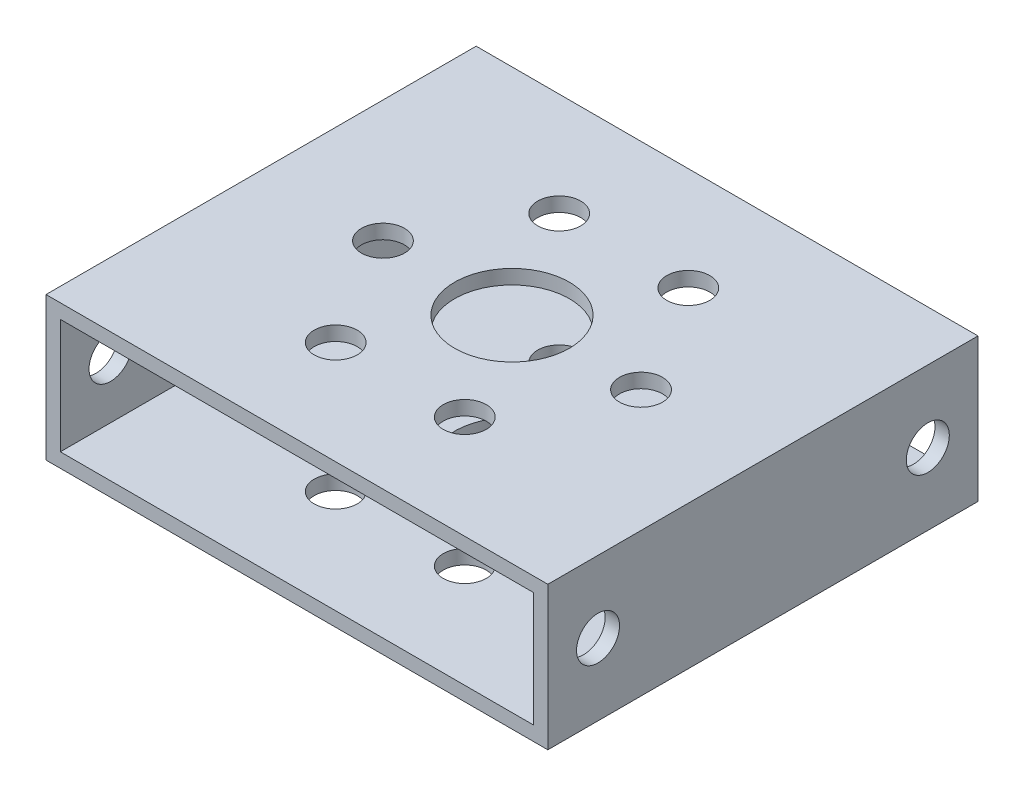
ISO-10303-21;
HEADER;
FILE_DESCRIPTION(('STEP AP214'),'2;1');
FILE_NAME('part.step','',(''),(''),'','','');
FILE_SCHEMA(('AUTOMOTIVE_DESIGN { 1 0 10303 214 1 1 1 1 }'));
ENDSEC;
DATA;
#1=APPLICATION_CONTEXT('core data for automotive mechanical design processes');
#2=APPLICATION_PROTOCOL_DEFINITION('international standard','automotive_design',2000,#1);
#3=PRODUCT_CONTEXT('',#1,'mechanical');
#4=PRODUCT('Part','Part','',(#3));
#5=PRODUCT_RELATED_PRODUCT_CATEGORY('part','',(#4));
#6=PRODUCT_DEFINITION_FORMATION('','',#4);
#7=PRODUCT_DEFINITION_CONTEXT('part definition',#1,'design');
#8=PRODUCT_DEFINITION('design','',#6,#7);
#9=PRODUCT_DEFINITION_SHAPE('','',#8);
#10=(LENGTH_UNIT() NAMED_UNIT(*) SI_UNIT(.MILLI.,.METRE.));
#11=(NAMED_UNIT(*) PLANE_ANGLE_UNIT() SI_UNIT($,.RADIAN.));
#12=(NAMED_UNIT(*) SI_UNIT($,.STERADIAN.) SOLID_ANGLE_UNIT());
#13=UNCERTAINTY_MEASURE_WITH_UNIT(LENGTH_MEASURE(1.E-05),#10,'distance_accuracy_value','');
#14=(GEOMETRIC_REPRESENTATION_CONTEXT(3) GLOBAL_UNCERTAINTY_ASSIGNED_CONTEXT((#13)) GLOBAL_UNIT_ASSIGNED_CONTEXT((#10,
#11,#12)) REPRESENTATION_CONTEXT('',''));
#15=CARTESIAN_POINT('',(0.,0.,0.));
#16=DIRECTION('',(0.,0.,1.));
#17=DIRECTION('',(1.,0.,0.));
#18=AXIS2_PLACEMENT_3D('',#15,#16,#17);
#19=CARTESIAN_POINT('',(0.,0.,15.));
#20=DIRECTION('',(0.,0.,-1.));
#21=DIRECTION('',(-1.,0.,0.));
#22=AXIS2_PLACEMENT_3D('',#19,#20,#21);
#23=PLANE('',#22);
#24=DIRECTION('',(0.,1.,0.));
#25=VECTOR('',#24,1.);
#26=CARTESIAN_POINT('',(17.5,-5.,15.));
#27=LINE('',#26,#25);
#28=CARTESIAN_POINT('',(17.5,-5.,15.));
#29=VERTEX_POINT('',#28);
#30=CARTESIAN_POINT('',(17.5,5.,15.));
#31=VERTEX_POINT('',#30);
#32=EDGE_CURVE('E140',#29,#31,#27,.T.);
#33=ORIENTED_EDGE('',*,*,#32,.T.);
#34=DIRECTION('',(-1.,0.,0.));
#35=VECTOR('',#34,1.);
#36=CARTESIAN_POINT('',(-17.5,5.,15.));
#37=LINE('',#36,#35);
#38=CARTESIAN_POINT('',(-17.5,5.,15.));
#39=VERTEX_POINT('',#38);
#40=EDGE_CURVE('E143',#31,#39,#37,.T.);
#41=ORIENTED_EDGE('',*,*,#40,.T.);
#42=DIRECTION('',(0.,-1.,0.));
#43=VECTOR('',#42,1.);
#44=CARTESIAN_POINT('',(-17.5,-5.,15.));
#45=LINE('',#44,#43);
#46=CARTESIAN_POINT('',(-17.5,-5.,15.));
#47=VERTEX_POINT('',#46);
#48=EDGE_CURVE('E146',#39,#47,#45,.T.);
#49=ORIENTED_EDGE('',*,*,#48,.T.);
#50=DIRECTION('',(1.,0.,0.));
#51=VECTOR('',#50,1.);
#52=CARTESIAN_POINT('',(-17.5,-5.,15.));
#53=LINE('',#52,#51);
#54=EDGE_CURVE('E148',#47,#29,#53,.T.);
#55=ORIENTED_EDGE('',*,*,#54,.T.);
#56=EDGE_LOOP('',(#33,#41,#49,#55));
#57=FACE_BOUND('',#56,.T.);
#58=DIRECTION('',(1.,0.,0.));
#59=VECTOR('',#58,1.);
#60=CARTESIAN_POINT('',(-16.5,-4.,15.));
#61=LINE('',#60,#59);
#62=CARTESIAN_POINT('',(-16.5,-4.,15.));
#63=VERTEX_POINT('',#62);
#64=CARTESIAN_POINT('',(16.5,-4.,15.));
#65=VERTEX_POINT('',#64);
#66=EDGE_CURVE('E102',#63,#65,#61,.T.);
#67=ORIENTED_EDGE('',*,*,#66,.F.);
#68=DIRECTION('',(0.,-1.,0.));
#69=VECTOR('',#68,1.);
#70=CARTESIAN_POINT('',(-16.5,-4.,15.));
#71=LINE('',#70,#69);
#72=CARTESIAN_POINT('',(-16.5,4.,15.));
#73=VERTEX_POINT('',#72);
#74=EDGE_CURVE('E124',#73,#63,#71,.T.);
#75=ORIENTED_EDGE('',*,*,#74,.F.);
#76=DIRECTION('',(-1.,0.,0.));
#77=VECTOR('',#76,1.);
#78=CARTESIAN_POINT('',(-16.5,4.,15.));
#79=LINE('',#78,#77);
#80=CARTESIAN_POINT('',(16.5,4.,15.));
#81=VERTEX_POINT('',#80);
#82=EDGE_CURVE('E122',#81,#73,#79,.T.);
#83=ORIENTED_EDGE('',*,*,#82,.F.);
#84=DIRECTION('',(0.,1.,0.));
#85=VECTOR('',#84,1.);
#86=CARTESIAN_POINT('',(16.5,-4.,15.));
#87=LINE('',#86,#85);
#88=EDGE_CURVE('E110',#65,#81,#87,.T.);
#89=ORIENTED_EDGE('',*,*,#88,.F.);
#90=EDGE_LOOP('',(#67,#75,#83,#89));
#91=FACE_BOUND('',#90,.T.);
#92=ADVANCED_FACE('F35',(#57,#91),#23,.F.);
#93=CARTESIAN_POINT('',(0.,0.,-15.));
#94=DIRECTION('',(0.,0.,-1.));
#95=DIRECTION('',(-1.,0.,0.));
#96=AXIS2_PLACEMENT_3D('',#93,#94,#95);
#97=PLANE('',#96);
#98=DIRECTION('',(0.,1.,0.));
#99=VECTOR('',#98,1.);
#100=CARTESIAN_POINT('',(17.5,-5.,-15.));
#101=LINE('',#100,#99);
#102=CARTESIAN_POINT('',(17.5,-5.,-15.));
#103=VERTEX_POINT('',#102);
#104=CARTESIAN_POINT('',(17.5,5.,-15.));
#105=VERTEX_POINT('',#104);
#106=EDGE_CURVE('E118',#103,#105,#101,.T.);
#107=ORIENTED_EDGE('',*,*,#106,.F.);
#108=DIRECTION('',(1.,0.,0.));
#109=VECTOR('',#108,1.);
#110=CARTESIAN_POINT('',(-17.5,-5.,-15.));
#111=LINE('',#110,#109);
#112=CARTESIAN_POINT('',(-17.5,-5.,-15.));
#113=VERTEX_POINT('',#112);
#114=EDGE_CURVE('E144',#113,#103,#111,.T.);
#115=ORIENTED_EDGE('',*,*,#114,.F.);
#116=DIRECTION('',(0.,-1.,0.));
#117=VECTOR('',#116,1.);
#118=CARTESIAN_POINT('',(-17.5,-5.,-15.));
#119=LINE('',#118,#117);
#120=CARTESIAN_POINT('',(-17.5,5.,-15.));
#121=VERTEX_POINT('',#120);
#122=EDGE_CURVE('E155',#121,#113,#119,.T.);
#123=ORIENTED_EDGE('',*,*,#122,.F.);
#124=DIRECTION('',(-1.,0.,0.));
#125=VECTOR('',#124,1.);
#126=CARTESIAN_POINT('',(-17.5,5.,-15.));
#127=LINE('',#126,#125);
#128=EDGE_CURVE('E153',#105,#121,#127,.T.);
#129=ORIENTED_EDGE('',*,*,#128,.F.);
#130=EDGE_LOOP('',(#107,#115,#123,#129));
#131=FACE_BOUND('',#130,.T.);
#132=DIRECTION('',(0.,-1.,0.));
#133=VECTOR('',#132,1.);
#134=CARTESIAN_POINT('',(-16.5,-4.,-15.));
#135=LINE('',#134,#133);
#136=CARTESIAN_POINT('',(-16.5,4.,-15.));
#137=VERTEX_POINT('',#136);
#138=CARTESIAN_POINT('',(-16.5,-4.,-15.));
#139=VERTEX_POINT('',#138);
#140=EDGE_CURVE('E111',#137,#139,#135,.T.);
#141=ORIENTED_EDGE('',*,*,#140,.T.);
#142=DIRECTION('',(1.,0.,0.));
#143=VECTOR('',#142,1.);
#144=CARTESIAN_POINT('',(-16.5,-4.,-15.));
#145=LINE('',#144,#143);
#146=CARTESIAN_POINT('',(16.5,-4.,-15.));
#147=VERTEX_POINT('',#146);
#148=EDGE_CURVE('E60',#139,#147,#145,.T.);
#149=ORIENTED_EDGE('',*,*,#148,.T.);
#150=DIRECTION('',(0.,1.,0.));
#151=VECTOR('',#150,1.);
#152=CARTESIAN_POINT('',(16.5,-4.,-15.));
#153=LINE('',#152,#151);
#154=CARTESIAN_POINT('',(16.5,4.,-15.));
#155=VERTEX_POINT('',#154);
#156=EDGE_CURVE('E117',#147,#155,#153,.T.);
#157=ORIENTED_EDGE('',*,*,#156,.T.);
#158=DIRECTION('',(-1.,0.,0.));
#159=VECTOR('',#158,1.);
#160=CARTESIAN_POINT('',(-16.5,4.,-15.));
#161=LINE('',#160,#159);
#162=EDGE_CURVE('E132',#155,#137,#161,.T.);
#163=ORIENTED_EDGE('',*,*,#162,.T.);
#164=EDGE_LOOP('',(#141,#149,#157,#163));
#165=FACE_BOUND('',#164,.T.);
#166=ADVANCED_FACE('F248',(#131,#165),#97,.T.);
#167=CARTESIAN_POINT('',(17.5,-5.,15.));
#168=DIRECTION('',(-1.,0.,0.));
#169=DIRECTION('',(0.,0.,1.));
#170=AXIS2_PLACEMENT_3D('',#167,#168,#169);
#171=PLANE('',#170);
#172=CARTESIAN_POINT('',(17.5,0.,-11.5));
#173=DIRECTION('',(1.,0.,0.));
#174=DIRECTION('',(0.,0.,-1.));
#175=AXIS2_PLACEMENT_3D('',#172,#173,#174);
#176=CIRCLE('',#175,1.5);
#177=CARTESIAN_POINT('',(17.5,0.,-13.));
#178=VERTEX_POINT('',#177);
#179=EDGE_CURVE('E169',#178,#178,#176,.T.);
#180=ORIENTED_EDGE('',*,*,#179,.F.);
#181=EDGE_LOOP('',(#180));
#182=FACE_BOUND('',#181,.T.);
#183=CARTESIAN_POINT('',(17.5,0.,11.5));
#184=DIRECTION('',(1.,0.,0.));
#185=DIRECTION('',(0.,0.,-1.));
#186=AXIS2_PLACEMENT_3D('',#183,#184,#185);
#187=CIRCLE('',#186,1.5);
#188=CARTESIAN_POINT('',(17.5,0.,10.));
#189=VERTEX_POINT('',#188);
#190=EDGE_CURVE('E212',#189,#189,#187,.T.);
#191=ORIENTED_EDGE('',*,*,#190,.F.);
#192=EDGE_LOOP('',(#191));
#193=FACE_BOUND('',#192,.T.);
#194=ORIENTED_EDGE('',*,*,#106,.T.);
#195=DIRECTION('',(0.,0.,-1.));
#196=VECTOR('',#195,1.);
#197=CARTESIAN_POINT('',(17.5,5.,15.));
#198=LINE('',#197,#196);
#199=EDGE_CURVE('E11',#31,#105,#198,.T.);
#200=ORIENTED_EDGE('',*,*,#199,.F.);
#201=ORIENTED_EDGE('',*,*,#32,.F.);
#202=DIRECTION('',(0.,0.,-1.));
#203=VECTOR('',#202,1.);
#204=CARTESIAN_POINT('',(17.5,-5.,15.));
#205=LINE('',#204,#203);
#206=EDGE_CURVE('E150',#29,#103,#205,.T.);
#207=ORIENTED_EDGE('',*,*,#206,.T.);
#208=EDGE_LOOP('',(#194,#200,#201,#207));
#209=FACE_BOUND('',#208,.T.);
#210=ADVANCED_FACE('F37',(#182,#193,#209),#171,.F.);
#211=CARTESIAN_POINT('',(-17.5,5.,15.));
#212=DIRECTION('',(0.,-1.,0.));
#213=DIRECTION('',(0.,0.,-1.));
#214=AXIS2_PLACEMENT_3D('',#211,#212,#213);
#215=PLANE('',#214);
#216=CARTESIAN_POINT('',(-4.49999999999995,5.,-7.79422863405997));
#217=DIRECTION('',(0.,1.,0.));
#218=DIRECTION('',(0.,0.,1.));
#219=AXIS2_PLACEMENT_3D('',#216,#217,#218);
#220=CIRCLE('',#219,1.5);
#221=CARTESIAN_POINT('',(-4.49999999999995,5.,-6.29422863405997));
#222=VERTEX_POINT('',#221);
#223=EDGE_CURVE('E275',#222,#222,#220,.T.);
#224=ORIENTED_EDGE('',*,*,#223,.F.);
#225=EDGE_LOOP('',(#224));
#226=FACE_BOUND('',#225,.T.);
#227=CARTESIAN_POINT('',(4.50000000000004,5.,-7.79422863405992));
#228=DIRECTION('',(0.,1.,0.));
#229=DIRECTION('',(0.,0.,1.));
#230=AXIS2_PLACEMENT_3D('',#227,#228,#229);
#231=CIRCLE('',#230,1.5);
#232=CARTESIAN_POINT('',(4.50000000000004,5.,-6.29422863405992));
#233=VERTEX_POINT('',#232);
#234=EDGE_CURVE('E279',#233,#233,#231,.T.);
#235=ORIENTED_EDGE('',*,*,#234,.F.);
#236=EDGE_LOOP('',(#235));
#237=FACE_BOUND('',#236,.T.);
#238=CARTESIAN_POINT('',(9.,5.,0.));
#239=DIRECTION('',(0.,1.,0.));
#240=DIRECTION('',(0.,0.,1.));
#241=AXIS2_PLACEMENT_3D('',#238,#239,#240);
#242=CIRCLE('',#241,1.5);
#243=CARTESIAN_POINT('',(9.,5.,1.50000000000005));
#244=VERTEX_POINT('',#243);
#245=EDGE_CURVE('E283',#244,#244,#242,.T.);
#246=ORIENTED_EDGE('',*,*,#245,.F.);
#247=EDGE_LOOP('',(#246));
#248=FACE_BOUND('',#247,.T.);
#249=CARTESIAN_POINT('',(4.49999999999995,5.,7.79422863405997));
#250=DIRECTION('',(0.,1.,0.));
#251=DIRECTION('',(0.,0.,1.));
#252=AXIS2_PLACEMENT_3D('',#249,#250,#251);
#253=CIRCLE('',#252,1.5);
#254=CARTESIAN_POINT('',(4.49999999999995,5.,9.29422863405997));
#255=VERTEX_POINT('',#254);
#256=EDGE_CURVE('E287',#255,#255,#253,.T.);
#257=ORIENTED_EDGE('',*,*,#256,.F.);
#258=EDGE_LOOP('',(#257));
#259=FACE_BOUND('',#258,.T.);
#260=CARTESIAN_POINT('',(-4.50000000000004,5.,7.79422863405992));
#261=DIRECTION('',(0.,1.,0.));
#262=DIRECTION('',(0.,0.,1.));
#263=AXIS2_PLACEMENT_3D('',#260,#261,#262);
#264=CIRCLE('',#263,1.5);
#265=CARTESIAN_POINT('',(-4.50000000000004,5.,9.29422863405992));
#266=VERTEX_POINT('',#265);
#267=EDGE_CURVE('E291',#266,#266,#264,.T.);
#268=ORIENTED_EDGE('',*,*,#267,.F.);
#269=EDGE_LOOP('',(#268));
#270=FACE_BOUND('',#269,.T.);
#271=CARTESIAN_POINT('',(-9.,5.,0.));
#272=DIRECTION('',(0.,1.,0.));
#273=DIRECTION('',(0.,0.,1.));
#274=AXIS2_PLACEMENT_3D('',#271,#272,#273);
#275=CIRCLE('',#274,1.5);
#276=CARTESIAN_POINT('',(-9.,5.,1.49999999999995));
#277=VERTEX_POINT('',#276);
#278=EDGE_CURVE('E295',#277,#277,#275,.T.);
#279=ORIENTED_EDGE('',*,*,#278,.F.);
#280=EDGE_LOOP('',(#279));
#281=FACE_BOUND('',#280,.T.);
#282=CARTESIAN_POINT('',(0.,5.,0.));
#283=DIRECTION('',(0.,1.,0.));
#284=DIRECTION('',(0.,0.,1.));
#285=AXIS2_PLACEMENT_3D('',#282,#283,#284);
#286=CIRCLE('',#285,4.);
#287=CARTESIAN_POINT('',(0.,5.,4.));
#288=VERTEX_POINT('',#287);
#289=EDGE_CURVE('E299',#288,#288,#286,.T.);
#290=ORIENTED_EDGE('',*,*,#289,.F.);
#291=EDGE_LOOP('',(#290));
#292=FACE_BOUND('',#291,.T.);
#293=ORIENTED_EDGE('',*,*,#128,.T.);
#294=DIRECTION('',(0.,0.,-1.));
#295=VECTOR('',#294,1.);
#296=CARTESIAN_POINT('',(-17.5,5.,15.));
#297=LINE('',#296,#295);
#298=EDGE_CURVE('E44',#39,#121,#297,.T.);
#299=ORIENTED_EDGE('',*,*,#298,.F.);
#300=ORIENTED_EDGE('',*,*,#40,.F.);
#301=ORIENTED_EDGE('',*,*,#199,.T.);
#302=EDGE_LOOP('',(#293,#299,#300,#301));
#303=FACE_BOUND('',#302,.T.);
#304=ADVANCED_FACE('F264',(#226,#237,#248,#259,#270,#281,#292,#303),#215,.F.);
#305=CARTESIAN_POINT('',(-17.5,-5.,15.));
#306=DIRECTION('',(1.,0.,0.));
#307=DIRECTION('',(0.,0.,-1.));
#308=AXIS2_PLACEMENT_3D('',#305,#306,#307);
#309=PLANE('',#308);
#310=CARTESIAN_POINT('',(-17.5,0.,-11.5));
#311=DIRECTION('',(1.,0.,0.));
#312=DIRECTION('',(0.,0.,-1.));
#313=AXIS2_PLACEMENT_3D('',#310,#311,#312);
#314=CIRCLE('',#313,1.5);
#315=CARTESIAN_POINT('',(-17.5,0.,-13.));
#316=VERTEX_POINT('',#315);
#317=EDGE_CURVE('E130',#316,#316,#314,.T.);
#318=ORIENTED_EDGE('',*,*,#317,.T.);
#319=EDGE_LOOP('',(#318));
#320=FACE_BOUND('',#319,.T.);
#321=CARTESIAN_POINT('',(-17.5,0.,11.5));
#322=DIRECTION('',(1.,0.,0.));
#323=DIRECTION('',(0.,0.,-1.));
#324=AXIS2_PLACEMENT_3D('',#321,#322,#323);
#325=CIRCLE('',#324,1.5);
#326=CARTESIAN_POINT('',(-17.5,0.,10.));
#327=VERTEX_POINT('',#326);
#328=EDGE_CURVE('E174',#327,#327,#325,.T.);
#329=ORIENTED_EDGE('',*,*,#328,.T.);
#330=EDGE_LOOP('',(#329));
#331=FACE_BOUND('',#330,.T.);
#332=ORIENTED_EDGE('',*,*,#122,.T.);
#333=DIRECTION('',(0.,0.,-1.));
#334=VECTOR('',#333,1.);
#335=CARTESIAN_POINT('',(-17.5,-5.,15.));
#336=LINE('',#335,#334);
#337=EDGE_CURVE('E160',#47,#113,#336,.T.);
#338=ORIENTED_EDGE('',*,*,#337,.F.);
#339=ORIENTED_EDGE('',*,*,#48,.F.);
#340=ORIENTED_EDGE('',*,*,#298,.T.);
#341=EDGE_LOOP('',(#332,#338,#339,#340));
#342=FACE_BOUND('',#341,.T.);
#343=ADVANCED_FACE('F225',(#320,#331,#342),#309,.F.);
#344=CARTESIAN_POINT('',(-17.5,-5.,15.));
#345=DIRECTION('',(0.,1.,0.));
#346=DIRECTION('',(0.,0.,1.));
#347=AXIS2_PLACEMENT_3D('',#344,#345,#346);
#348=PLANE('',#347);
#349=CARTESIAN_POINT('',(-4.49999999999995,-5.,-7.79422863405997));
#350=DIRECTION('',(0.,1.,0.));
#351=DIRECTION('',(0.,0.,1.));
#352=AXIS2_PLACEMENT_3D('',#349,#350,#351);
#353=CIRCLE('',#352,1.5);
#354=CARTESIAN_POINT('',(-4.49999999999995,-5.,-6.29422863405997));
#355=VERTEX_POINT('',#354);
#356=EDGE_CURVE('E385',#355,#355,#353,.T.);
#357=ORIENTED_EDGE('',*,*,#356,.T.);
#358=EDGE_LOOP('',(#357));
#359=FACE_BOUND('',#358,.T.);
#360=CARTESIAN_POINT('',(4.50000000000004,-5.,-7.79422863405992));
#361=DIRECTION('',(0.,1.,0.));
#362=DIRECTION('',(0.,0.,1.));
#363=AXIS2_PLACEMENT_3D('',#360,#361,#362);
#364=CIRCLE('',#363,1.5);
#365=CARTESIAN_POINT('',(4.50000000000004,-5.,-6.29422863405992));
#366=VERTEX_POINT('',#365);
#367=EDGE_CURVE('E389',#366,#366,#364,.T.);
#368=ORIENTED_EDGE('',*,*,#367,.T.);
#369=EDGE_LOOP('',(#368));
#370=FACE_BOUND('',#369,.T.);
#371=CARTESIAN_POINT('',(9.,-5.,0.));
#372=DIRECTION('',(0.,1.,0.));
#373=DIRECTION('',(0.,0.,1.));
#374=AXIS2_PLACEMENT_3D('',#371,#372,#373);
#375=CIRCLE('',#374,1.5);
#376=CARTESIAN_POINT('',(9.,-5.,1.50000000000005));
#377=VERTEX_POINT('',#376);
#378=EDGE_CURVE('E393',#377,#377,#375,.T.);
#379=ORIENTED_EDGE('',*,*,#378,.T.);
#380=EDGE_LOOP('',(#379));
#381=FACE_BOUND('',#380,.T.);
#382=CARTESIAN_POINT('',(4.49999999999995,-5.,7.79422863405997));
#383=DIRECTION('',(0.,1.,0.));
#384=DIRECTION('',(0.,0.,1.));
#385=AXIS2_PLACEMENT_3D('',#382,#383,#384);
#386=CIRCLE('',#385,1.5);
#387=CARTESIAN_POINT('',(4.49999999999995,-5.,9.29422863405997));
#388=VERTEX_POINT('',#387);
#389=EDGE_CURVE('E377',#388,#388,#386,.T.);
#390=ORIENTED_EDGE('',*,*,#389,.T.);
#391=EDGE_LOOP('',(#390));
#392=FACE_BOUND('',#391,.T.);
#393=CARTESIAN_POINT('',(-4.50000000000004,-5.,7.79422863405992));
#394=DIRECTION('',(0.,1.,0.));
#395=DIRECTION('',(0.,0.,1.));
#396=AXIS2_PLACEMENT_3D('',#393,#394,#395);
#397=CIRCLE('',#396,1.5);
#398=CARTESIAN_POINT('',(-4.50000000000004,-5.,9.29422863405992));
#399=VERTEX_POINT('',#398);
#400=EDGE_CURVE('E374',#399,#399,#397,.T.);
#401=ORIENTED_EDGE('',*,*,#400,.T.);
#402=EDGE_LOOP('',(#401));
#403=FACE_BOUND('',#402,.T.);
#404=CARTESIAN_POINT('',(-9.,-5.,0.));
#405=DIRECTION('',(0.,1.,0.));
#406=DIRECTION('',(0.,0.,1.));
#407=AXIS2_PLACEMENT_3D('',#404,#405,#406);
#408=CIRCLE('',#407,1.5);
#409=CARTESIAN_POINT('',(-9.,-5.,1.49999999999995));
#410=VERTEX_POINT('',#409);
#411=EDGE_CURVE('E379',#410,#410,#408,.T.);
#412=ORIENTED_EDGE('',*,*,#411,.T.);
#413=EDGE_LOOP('',(#412));
#414=FACE_BOUND('',#413,.T.);
#415=CARTESIAN_POINT('',(0.,-5.,0.));
#416=DIRECTION('',(0.,1.,0.));
#417=DIRECTION('',(0.,0.,1.));
#418=AXIS2_PLACEMENT_3D('',#415,#416,#417);
#419=CIRCLE('',#418,4.);
#420=CARTESIAN_POINT('',(0.,-5.,4.));
#421=VERTEX_POINT('',#420);
#422=EDGE_CURVE('E179',#421,#421,#419,.T.);
#423=ORIENTED_EDGE('',*,*,#422,.T.);
#424=EDGE_LOOP('',(#423));
#425=FACE_BOUND('',#424,.T.);
#426=ORIENTED_EDGE('',*,*,#114,.T.);
#427=ORIENTED_EDGE('',*,*,#206,.F.);
#428=ORIENTED_EDGE('',*,*,#54,.F.);
#429=ORIENTED_EDGE('',*,*,#337,.T.);
#430=EDGE_LOOP('',(#426,#427,#428,#429));
#431=FACE_BOUND('',#430,.T.);
#432=ADVANCED_FACE('F259',(#359,#370,#381,#392,#403,#414,#425,#431),#348,.F.);
#433=CARTESIAN_POINT('',(-16.5,-4.,15.));
#434=DIRECTION('',(0.,1.,0.));
#435=DIRECTION('',(0.,0.,1.));
#436=AXIS2_PLACEMENT_3D('',#433,#434,#435);
#437=PLANE('',#436);
#438=CARTESIAN_POINT('',(-4.49999999999995,-4.,-7.79422863405997));
#439=DIRECTION('',(0.,1.,0.));
#440=DIRECTION('',(0.,0.,1.));
#441=AXIS2_PLACEMENT_3D('',#438,#439,#440);
#442=CIRCLE('',#441,1.5);
#443=CARTESIAN_POINT('',(-4.49999999999995,-4.,-6.29422863405997));
#444=VERTEX_POINT('',#443);
#445=EDGE_CURVE('E209',#444,#444,#442,.T.);
#446=ORIENTED_EDGE('',*,*,#445,.F.);
#447=EDGE_LOOP('',(#446));
#448=FACE_BOUND('',#447,.T.);
#449=CARTESIAN_POINT('',(4.50000000000004,-4.,-7.79422863405992));
#450=DIRECTION('',(0.,1.,0.));
#451=DIRECTION('',(0.,0.,1.));
#452=AXIS2_PLACEMENT_3D('',#449,#450,#451);
#453=CIRCLE('',#452,1.5);
#454=CARTESIAN_POINT('',(4.50000000000004,-4.,-6.29422863405992));
#455=VERTEX_POINT('',#454);
#456=EDGE_CURVE('E197',#455,#455,#453,.T.);
#457=ORIENTED_EDGE('',*,*,#456,.F.);
#458=EDGE_LOOP('',(#457));
#459=FACE_BOUND('',#458,.T.);
#460=CARTESIAN_POINT('',(9.,-4.,0.));
#461=DIRECTION('',(0.,1.,0.));
#462=DIRECTION('',(0.,0.,1.));
#463=AXIS2_PLACEMENT_3D('',#460,#461,#462);
#464=CIRCLE('',#463,1.5);
#465=CARTESIAN_POINT('',(9.,-4.,1.50000000000005));
#466=VERTEX_POINT('',#465);
#467=EDGE_CURVE('E194',#466,#466,#464,.T.);
#468=ORIENTED_EDGE('',*,*,#467,.F.);
#469=EDGE_LOOP('',(#468));
#470=FACE_BOUND('',#469,.T.);
#471=CARTESIAN_POINT('',(4.49999999999995,-4.,7.79422863405997));
#472=DIRECTION('',(0.,1.,0.));
#473=DIRECTION('',(0.,0.,1.));
#474=AXIS2_PLACEMENT_3D('',#471,#472,#473);
#475=CIRCLE('',#474,1.5);
#476=CARTESIAN_POINT('',(4.49999999999995,-4.,9.29422863405997));
#477=VERTEX_POINT('',#476);
#478=EDGE_CURVE('E191',#477,#477,#475,.T.);
#479=ORIENTED_EDGE('',*,*,#478,.F.);
#480=EDGE_LOOP('',(#479));
#481=FACE_BOUND('',#480,.T.);
#482=CARTESIAN_POINT('',(-4.50000000000004,-4.,7.79422863405992));
#483=DIRECTION('',(0.,1.,0.));
#484=DIRECTION('',(0.,0.,1.));
#485=AXIS2_PLACEMENT_3D('',#482,#483,#484);
#486=CIRCLE('',#485,1.5);
#487=CARTESIAN_POINT('',(-4.50000000000004,-4.,9.29422863405992));
#488=VERTEX_POINT('',#487);
#489=EDGE_CURVE('E187',#488,#488,#486,.T.);
#490=ORIENTED_EDGE('',*,*,#489,.F.);
#491=EDGE_LOOP('',(#490));
#492=FACE_BOUND('',#491,.T.);
#493=CARTESIAN_POINT('',(-9.,-4.,0.));
#494=DIRECTION('',(0.,1.,0.));
#495=DIRECTION('',(0.,0.,1.));
#496=AXIS2_PLACEMENT_3D('',#493,#494,#495);
#497=CIRCLE('',#496,1.5);
#498=CARTESIAN_POINT('',(-9.,-4.,1.49999999999995));
#499=VERTEX_POINT('',#498);
#500=EDGE_CURVE('E183',#499,#499,#497,.T.);
#501=ORIENTED_EDGE('',*,*,#500,.F.);
#502=EDGE_LOOP('',(#501));
#503=FACE_BOUND('',#502,.T.);
#504=CARTESIAN_POINT('',(0.,-4.,0.));
#505=DIRECTION('',(0.,1.,0.));
#506=DIRECTION('',(0.,0.,1.));
#507=AXIS2_PLACEMENT_3D('',#504,#505,#506);
#508=CIRCLE('',#507,4.);
#509=CARTESIAN_POINT('',(0.,-4.,4.));
#510=VERTEX_POINT('',#509);
#511=EDGE_CURVE('E178',#510,#510,#508,.T.);
#512=ORIENTED_EDGE('',*,*,#511,.F.);
#513=EDGE_LOOP('',(#512));
#514=FACE_BOUND('',#513,.T.);
#515=ORIENTED_EDGE('',*,*,#148,.F.);
#516=DIRECTION('',(0.,0.,-1.));
#517=VECTOR('',#516,1.);
#518=CARTESIAN_POINT('',(-16.5,-4.,15.));
#519=LINE('',#518,#517);
#520=EDGE_CURVE('E106',#63,#139,#519,.T.);
#521=ORIENTED_EDGE('',*,*,#520,.F.);
#522=ORIENTED_EDGE('',*,*,#66,.T.);
#523=DIRECTION('',(0.,0.,-1.));
#524=VECTOR('',#523,1.);
#525=CARTESIAN_POINT('',(16.5,-4.,15.));
#526=LINE('',#525,#524);
#527=EDGE_CURVE('E105',#65,#147,#526,.T.);
#528=ORIENTED_EDGE('',*,*,#527,.T.);
#529=EDGE_LOOP('',(#515,#521,#522,#528));
#530=FACE_BOUND('',#529,.T.);
#531=ADVANCED_FACE('F104',(#448,#459,#470,#481,#492,#503,#514,#530),#437,.T.);
#532=CARTESIAN_POINT('',(16.5,-4.,15.));
#533=DIRECTION('',(-1.,0.,0.));
#534=DIRECTION('',(0.,0.,1.));
#535=AXIS2_PLACEMENT_3D('',#532,#533,#534);
#536=PLANE('',#535);
#537=CARTESIAN_POINT('',(16.5,0.,-11.5));
#538=DIRECTION('',(-1.,0.,0.));
#539=DIRECTION('',(0.,0.,1.));
#540=AXIS2_PLACEMENT_3D('',#537,#538,#539);
#541=CIRCLE('',#540,1.5);
#542=CARTESIAN_POINT('',(16.5,0.,-10.));
#543=VERTEX_POINT('',#542);
#544=EDGE_CURVE('E173',#543,#543,#541,.T.);
#545=ORIENTED_EDGE('',*,*,#544,.F.);
#546=EDGE_LOOP('',(#545));
#547=FACE_BOUND('',#546,.T.);
#548=CARTESIAN_POINT('',(16.5,0.,11.5));
#549=DIRECTION('',(-1.,0.,0.));
#550=DIRECTION('',(0.,0.,1.));
#551=AXIS2_PLACEMENT_3D('',#548,#549,#550);
#552=CIRCLE('',#551,1.5);
#553=CARTESIAN_POINT('',(16.5,0.,13.));
#554=VERTEX_POINT('',#553);
#555=EDGE_CURVE('E168',#554,#554,#552,.T.);
#556=ORIENTED_EDGE('',*,*,#555,.F.);
#557=EDGE_LOOP('',(#556));
#558=FACE_BOUND('',#557,.T.);
#559=ORIENTED_EDGE('',*,*,#156,.F.);
#560=ORIENTED_EDGE('',*,*,#527,.F.);
#561=ORIENTED_EDGE('',*,*,#88,.T.);
#562=DIRECTION('',(0.,0.,-1.));
#563=VECTOR('',#562,1.);
#564=CARTESIAN_POINT('',(16.5,4.,15.));
#565=LINE('',#564,#563);
#566=EDGE_CURVE('E119',#81,#155,#565,.T.);
#567=ORIENTED_EDGE('',*,*,#566,.T.);
#568=EDGE_LOOP('',(#559,#560,#561,#567));
#569=FACE_BOUND('',#568,.T.);
#570=ADVANCED_FACE('F114',(#547,#558,#569),#536,.T.);
#571=CARTESIAN_POINT('',(-16.5,4.,15.));
#572=DIRECTION('',(0.,-1.,0.));
#573=DIRECTION('',(1.,0.,0.));
#574=AXIS2_PLACEMENT_3D('',#571,#572,#573);
#575=PLANE('',#574);
#576=CARTESIAN_POINT('',(-4.49999999999995,4.,-7.79422863405997));
#577=DIRECTION('',(0.,-1.,0.));
#578=DIRECTION('',(1.,0.,0.));
#579=AXIS2_PLACEMENT_3D('',#576,#577,#578);
#580=CIRCLE('',#579,1.5);
#581=CARTESIAN_POINT('',(-2.99999999999995,4.,-7.79422863405997));
#582=VERTEX_POINT('',#581);
#583=EDGE_CURVE('E39',#582,#582,#580,.T.);
#584=ORIENTED_EDGE('',*,*,#583,.F.);
#585=EDGE_LOOP('',(#584));
#586=FACE_BOUND('',#585,.T.);
#587=CARTESIAN_POINT('',(4.50000000000004,4.,-7.79422863405992));
#588=DIRECTION('',(0.,-1.,0.));
#589=DIRECTION('',(1.,0.,0.));
#590=AXIS2_PLACEMENT_3D('',#587,#588,#589);
#591=CIRCLE('',#590,1.5);
#592=CARTESIAN_POINT('',(6.00000000000004,4.,-7.79422863405992));
#593=VERTEX_POINT('',#592);
#594=EDGE_CURVE('E195',#593,#593,#591,.T.);
#595=ORIENTED_EDGE('',*,*,#594,.F.);
#596=EDGE_LOOP('',(#595));
#597=FACE_BOUND('',#596,.T.);
#598=CARTESIAN_POINT('',(9.,4.,0.));
#599=DIRECTION('',(0.,-1.,0.));
#600=DIRECTION('',(1.,0.,0.));
#601=AXIS2_PLACEMENT_3D('',#598,#599,#600);
#602=CIRCLE('',#601,1.5);
#603=CARTESIAN_POINT('',(10.5,4.,0.));
#604=VERTEX_POINT('',#603);
#605=EDGE_CURVE('E192',#604,#604,#602,.T.);
#606=ORIENTED_EDGE('',*,*,#605,.F.);
#607=EDGE_LOOP('',(#606));
#608=FACE_BOUND('',#607,.T.);
#609=CARTESIAN_POINT('',(4.49999999999995,4.,7.79422863405997));
#610=DIRECTION('',(0.,-1.,0.));
#611=DIRECTION('',(1.,0.,0.));
#612=AXIS2_PLACEMENT_3D('',#609,#610,#611);
#613=CIRCLE('',#612,1.5);
#614=CARTESIAN_POINT('',(5.99999999999995,4.,7.79422863405997));
#615=VERTEX_POINT('',#614);
#616=EDGE_CURVE('E188',#615,#615,#613,.T.);
#617=ORIENTED_EDGE('',*,*,#616,.F.);
#618=EDGE_LOOP('',(#617));
#619=FACE_BOUND('',#618,.T.);
#620=CARTESIAN_POINT('',(-4.50000000000004,4.,7.79422863405992));
#621=DIRECTION('',(0.,-1.,0.));
#622=DIRECTION('',(1.,0.,0.));
#623=AXIS2_PLACEMENT_3D('',#620,#621,#622);
#624=CIRCLE('',#623,1.5);
#625=CARTESIAN_POINT('',(-3.00000000000004,4.,7.79422863405992));
#626=VERTEX_POINT('',#625);
#627=EDGE_CURVE('E184',#626,#626,#624,.T.);
#628=ORIENTED_EDGE('',*,*,#627,.F.);
#629=EDGE_LOOP('',(#628));
#630=FACE_BOUND('',#629,.T.);
#631=CARTESIAN_POINT('',(-9.,4.,0.));
#632=DIRECTION('',(0.,-1.,0.));
#633=DIRECTION('',(1.,0.,0.));
#634=AXIS2_PLACEMENT_3D('',#631,#632,#633);
#635=CIRCLE('',#634,1.5);
#636=CARTESIAN_POINT('',(-7.5,4.,0.));
#637=VERTEX_POINT('',#636);
#638=EDGE_CURVE('E180',#637,#637,#635,.T.);
#639=ORIENTED_EDGE('',*,*,#638,.F.);
#640=EDGE_LOOP('',(#639));
#641=FACE_BOUND('',#640,.T.);
#642=CARTESIAN_POINT('',(0.,4.,0.));
#643=DIRECTION('',(0.,-1.,0.));
#644=DIRECTION('',(1.,0.,0.));
#645=AXIS2_PLACEMENT_3D('',#642,#643,#644);
#646=CIRCLE('',#645,4.);
#647=CARTESIAN_POINT('',(4.,4.,0.));
#648=VERTEX_POINT('',#647);
#649=EDGE_CURVE('E175',#648,#648,#646,.T.);
#650=ORIENTED_EDGE('',*,*,#649,.F.);
#651=EDGE_LOOP('',(#650));
#652=FACE_BOUND('',#651,.T.);
#653=ORIENTED_EDGE('',*,*,#162,.F.);
#654=ORIENTED_EDGE('',*,*,#566,.F.);
#655=ORIENTED_EDGE('',*,*,#82,.T.);
#656=DIRECTION('',(0.,0.,-1.));
#657=VECTOR('',#656,1.);
#658=CARTESIAN_POINT('',(-16.5,4.,15.));
#659=LINE('',#658,#657);
#660=EDGE_CURVE('E52',#73,#137,#659,.T.);
#661=ORIENTED_EDGE('',*,*,#660,.T.);
#662=EDGE_LOOP('',(#653,#654,#655,#661));
#663=FACE_BOUND('',#662,.T.);
#664=ADVANCED_FACE('F316',(#586,#597,#608,#619,#630,#641,#652,#663),#575,.T.);
#665=CARTESIAN_POINT('',(-16.5,-4.,15.));
#666=DIRECTION('',(1.,0.,0.));
#667=DIRECTION('',(0.,0.,-1.));
#668=AXIS2_PLACEMENT_3D('',#665,#666,#667);
#669=PLANE('',#668);
#670=CARTESIAN_POINT('',(-16.5,0.,-11.5));
#671=DIRECTION('',(1.,0.,0.));
#672=DIRECTION('',(0.,0.,-1.));
#673=AXIS2_PLACEMENT_3D('',#670,#671,#672);
#674=CIRCLE('',#673,1.5);
#675=CARTESIAN_POINT('',(-16.5,0.,-13.));
#676=VERTEX_POINT('',#675);
#677=EDGE_CURVE('E170',#676,#676,#674,.T.);
#678=ORIENTED_EDGE('',*,*,#677,.F.);
#679=EDGE_LOOP('',(#678));
#680=FACE_BOUND('',#679,.T.);
#681=CARTESIAN_POINT('',(-16.5,0.,11.5));
#682=DIRECTION('',(1.,0.,0.));
#683=DIRECTION('',(0.,0.,-1.));
#684=AXIS2_PLACEMENT_3D('',#681,#682,#683);
#685=CIRCLE('',#684,1.5);
#686=CARTESIAN_POINT('',(-16.5,0.,10.));
#687=VERTEX_POINT('',#686);
#688=EDGE_CURVE('E165',#687,#687,#685,.T.);
#689=ORIENTED_EDGE('',*,*,#688,.F.);
#690=EDGE_LOOP('',(#689));
#691=FACE_BOUND('',#690,.T.);
#692=ORIENTED_EDGE('',*,*,#140,.F.);
#693=ORIENTED_EDGE('',*,*,#660,.F.);
#694=ORIENTED_EDGE('',*,*,#74,.T.);
#695=ORIENTED_EDGE('',*,*,#520,.T.);
#696=EDGE_LOOP('',(#692,#693,#694,#695));
#697=FACE_BOUND('',#696,.T.);
#698=ADVANCED_FACE('F241',(#680,#691,#697),#669,.T.);
#699=CARTESIAN_POINT('',(-32.5,0.,11.5));
#700=DIRECTION('',(1.,0.,0.));
#701=DIRECTION('',(0.,0.,-1.));
#702=AXIS2_PLACEMENT_3D('',#699,#700,#701);
#703=CYLINDRICAL_SURFACE('',#702,1.5);
#704=ORIENTED_EDGE('',*,*,#688,.T.);
#705=EDGE_LOOP('',(#704));
#706=FACE_BOUND('',#705,.T.);
#707=ORIENTED_EDGE('',*,*,#328,.F.);
#708=EDGE_LOOP('',(#707));
#709=FACE_BOUND('',#708,.T.);
#710=ADVANCED_FACE('F231',(#706,#709),#703,.F.);
#711=CARTESIAN_POINT('',(-32.5,0.,-11.5));
#712=DIRECTION('',(1.,0.,0.));
#713=DIRECTION('',(0.,0.,-1.));
#714=AXIS2_PLACEMENT_3D('',#711,#712,#713);
#715=CYLINDRICAL_SURFACE('',#714,1.5);
#716=ORIENTED_EDGE('',*,*,#677,.T.);
#717=EDGE_LOOP('',(#716));
#718=FACE_BOUND('',#717,.T.);
#719=ORIENTED_EDGE('',*,*,#317,.F.);
#720=EDGE_LOOP('',(#719));
#721=FACE_BOUND('',#720,.T.);
#722=ADVANCED_FACE('F228',(#718,#721),#715,.F.);
#723=ORIENTED_EDGE('',*,*,#555,.T.);
#724=EDGE_LOOP('',(#723));
#725=FACE_BOUND('',#724,.T.);
#726=ORIENTED_EDGE('',*,*,#190,.T.);
#727=EDGE_LOOP('',(#726));
#728=FACE_BOUND('',#727,.T.);
#729=ADVANCED_FACE('F230',(#725,#728),#703,.F.);
#730=ORIENTED_EDGE('',*,*,#544,.T.);
#731=EDGE_LOOP('',(#730));
#732=FACE_BOUND('',#731,.T.);
#733=ORIENTED_EDGE('',*,*,#179,.T.);
#734=EDGE_LOOP('',(#733));
#735=FACE_BOUND('',#734,.T.);
#736=ADVANCED_FACE('F234',(#732,#735),#715,.F.);
#737=CARTESIAN_POINT('',(0.,-5.,0.));
#738=DIRECTION('',(0.,1.,0.));
#739=DIRECTION('',(0.,0.,1.));
#740=AXIS2_PLACEMENT_3D('',#737,#738,#739);
#741=CYLINDRICAL_SURFACE('',#740,4.);
#742=ORIENTED_EDGE('',*,*,#649,.T.);
#743=EDGE_LOOP('',(#742));
#744=FACE_BOUND('',#743,.T.);
#745=ORIENTED_EDGE('',*,*,#289,.T.);
#746=EDGE_LOOP('',(#745));
#747=FACE_BOUND('',#746,.T.);
#748=ADVANCED_FACE('F245',(#744,#747),#741,.F.);
#749=CARTESIAN_POINT('',(-9.,-5.,0.));
#750=DIRECTION('',(0.,1.,0.));
#751=DIRECTION('',(0.,0.,1.));
#752=AXIS2_PLACEMENT_3D('',#749,#750,#751);
#753=CYLINDRICAL_SURFACE('',#752,1.5);
#754=ORIENTED_EDGE('',*,*,#638,.T.);
#755=EDGE_LOOP('',(#754));
#756=FACE_BOUND('',#755,.T.);
#757=ORIENTED_EDGE('',*,*,#278,.T.);
#758=EDGE_LOOP('',(#757));
#759=FACE_BOUND('',#758,.T.);
#760=ADVANCED_FACE('F403',(#756,#759),#753,.F.);
#761=CARTESIAN_POINT('',(-4.50000000000004,-5.,7.79422863405992));
#762=DIRECTION('',(0.,1.,0.));
#763=DIRECTION('',(0.,0.,1.));
#764=AXIS2_PLACEMENT_3D('',#761,#762,#763);
#765=CYLINDRICAL_SURFACE('',#764,1.5);
#766=ORIENTED_EDGE('',*,*,#627,.T.);
#767=EDGE_LOOP('',(#766));
#768=FACE_BOUND('',#767,.T.);
#769=ORIENTED_EDGE('',*,*,#267,.T.);
#770=EDGE_LOOP('',(#769));
#771=FACE_BOUND('',#770,.T.);
#772=ADVANCED_FACE('F371',(#768,#771),#765,.F.);
#773=CARTESIAN_POINT('',(4.49999999999995,-5.,7.79422863405997));
#774=DIRECTION('',(0.,1.,0.));
#775=DIRECTION('',(0.,0.,1.));
#776=AXIS2_PLACEMENT_3D('',#773,#774,#775);
#777=CYLINDRICAL_SURFACE('',#776,1.5);
#778=ORIENTED_EDGE('',*,*,#616,.T.);
#779=EDGE_LOOP('',(#778));
#780=FACE_BOUND('',#779,.T.);
#781=ORIENTED_EDGE('',*,*,#256,.T.);
#782=EDGE_LOOP('',(#781));
#783=FACE_BOUND('',#782,.T.);
#784=ADVANCED_FACE('F453',(#780,#783),#777,.F.);
#785=CARTESIAN_POINT('',(9.,-5.,0.));
#786=DIRECTION('',(0.,1.,0.));
#787=DIRECTION('',(0.,0.,1.));
#788=AXIS2_PLACEMENT_3D('',#785,#786,#787);
#789=CYLINDRICAL_SURFACE('',#788,1.5);
#790=ORIENTED_EDGE('',*,*,#605,.T.);
#791=EDGE_LOOP('',(#790));
#792=FACE_BOUND('',#791,.T.);
#793=ORIENTED_EDGE('',*,*,#245,.T.);
#794=EDGE_LOOP('',(#793));
#795=FACE_BOUND('',#794,.T.);
#796=ADVANCED_FACE('F427',(#792,#795),#789,.F.);
#797=CARTESIAN_POINT('',(4.50000000000004,-5.,-7.79422863405992));
#798=DIRECTION('',(0.,1.,0.));
#799=DIRECTION('',(0.,0.,1.));
#800=AXIS2_PLACEMENT_3D('',#797,#798,#799);
#801=CYLINDRICAL_SURFACE('',#800,1.5);
#802=ORIENTED_EDGE('',*,*,#594,.T.);
#803=EDGE_LOOP('',(#802));
#804=FACE_BOUND('',#803,.T.);
#805=ORIENTED_EDGE('',*,*,#234,.T.);
#806=EDGE_LOOP('',(#805));
#807=FACE_BOUND('',#806,.T.);
#808=ADVANCED_FACE('F419',(#804,#807),#801,.F.);
#809=CARTESIAN_POINT('',(-4.49999999999995,-5.,-7.79422863405997));
#810=DIRECTION('',(0.,1.,0.));
#811=DIRECTION('',(0.,0.,1.));
#812=AXIS2_PLACEMENT_3D('',#809,#810,#811);
#813=CYLINDRICAL_SURFACE('',#812,1.5);
#814=ORIENTED_EDGE('',*,*,#583,.T.);
#815=EDGE_LOOP('',(#814));
#816=FACE_BOUND('',#815,.T.);
#817=ORIENTED_EDGE('',*,*,#223,.T.);
#818=EDGE_LOOP('',(#817));
#819=FACE_BOUND('',#818,.T.);
#820=ADVANCED_FACE('F413',(#816,#819),#813,.F.);
#821=ORIENTED_EDGE('',*,*,#511,.T.);
#822=EDGE_LOOP('',(#821));
#823=FACE_BOUND('',#822,.T.);
#824=ORIENTED_EDGE('',*,*,#422,.F.);
#825=EDGE_LOOP('',(#824));
#826=FACE_BOUND('',#825,.T.);
#827=ADVANCED_FACE('F405',(#823,#826),#741,.F.);
#828=ORIENTED_EDGE('',*,*,#500,.T.);
#829=EDGE_LOOP('',(#828));
#830=FACE_BOUND('',#829,.T.);
#831=ORIENTED_EDGE('',*,*,#411,.F.);
#832=EDGE_LOOP('',(#831));
#833=FACE_BOUND('',#832,.T.);
#834=ADVANCED_FACE('F369',(#830,#833),#753,.F.);
#835=ORIENTED_EDGE('',*,*,#489,.T.);
#836=EDGE_LOOP('',(#835));
#837=FACE_BOUND('',#836,.T.);
#838=ORIENTED_EDGE('',*,*,#400,.F.);
#839=EDGE_LOOP('',(#838));
#840=FACE_BOUND('',#839,.T.);
#841=ADVANCED_FACE('F365',(#837,#840),#765,.F.);
#842=ORIENTED_EDGE('',*,*,#478,.T.);
#843=EDGE_LOOP('',(#842));
#844=FACE_BOUND('',#843,.T.);
#845=ORIENTED_EDGE('',*,*,#389,.F.);
#846=EDGE_LOOP('',(#845));
#847=FACE_BOUND('',#846,.T.);
#848=ADVANCED_FACE('F368',(#844,#847),#777,.F.);
#849=ORIENTED_EDGE('',*,*,#467,.T.);
#850=EDGE_LOOP('',(#849));
#851=FACE_BOUND('',#850,.T.);
#852=ORIENTED_EDGE('',*,*,#378,.F.);
#853=EDGE_LOOP('',(#852));
#854=FACE_BOUND('',#853,.T.);
#855=ADVANCED_FACE('F437',(#851,#854),#789,.F.);
#856=ORIENTED_EDGE('',*,*,#456,.T.);
#857=EDGE_LOOP('',(#856));
#858=FACE_BOUND('',#857,.T.);
#859=ORIENTED_EDGE('',*,*,#367,.F.);
#860=EDGE_LOOP('',(#859));
#861=FACE_BOUND('',#860,.T.);
#862=ADVANCED_FACE('F429',(#858,#861),#801,.F.);
#863=ORIENTED_EDGE('',*,*,#445,.T.);
#864=EDGE_LOOP('',(#863));
#865=FACE_BOUND('',#864,.T.);
#866=ORIENTED_EDGE('',*,*,#356,.F.);
#867=EDGE_LOOP('',(#866));
#868=FACE_BOUND('',#867,.T.);
#869=ADVANCED_FACE('F422',(#865,#868),#813,.F.);
#870=CLOSED_SHELL('',(#92,#166,#210,#304,#343,#432,#531,#570,#664,#698,#710,#722,#729,#736,#748,
#760,#772,#784,#796,#808,#820,#827,#834,#841,#848,#855,#862,#869));
#871=MANIFOLD_SOLID_BREP('B2',#870);
#872=ADVANCED_BREP_SHAPE_REPRESENTATION('',(#18,#871),#14);
#873=SHAPE_DEFINITION_REPRESENTATION(#9,#872);
ENDSEC;
END-ISO-10303-21;
